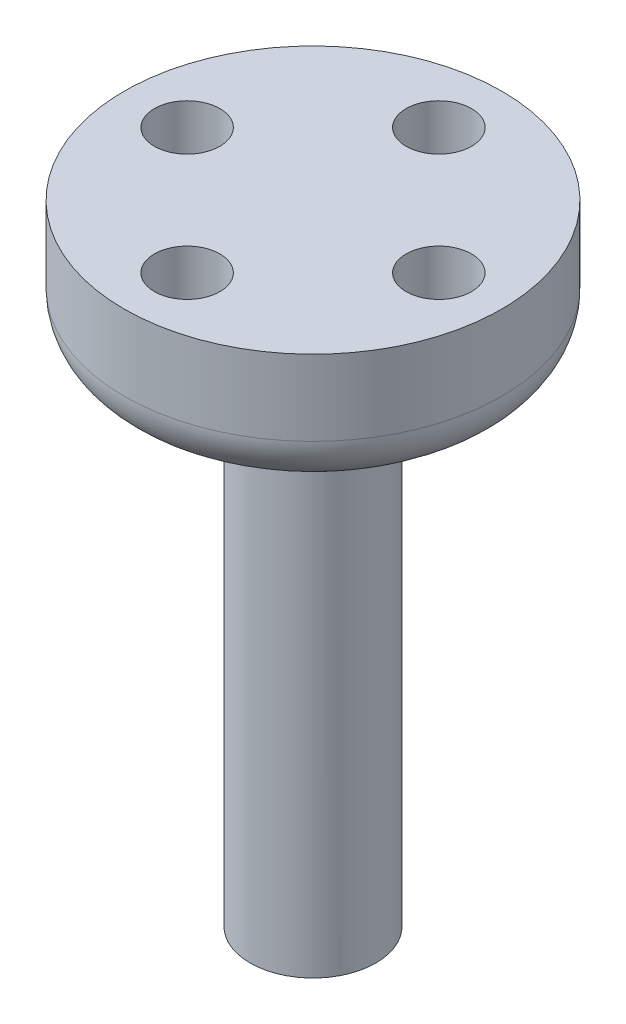
ISO-10303-21;
HEADER;
FILE_DESCRIPTION(('STEP AP214'),'2;1');
FILE_NAME('part.step','',(''),(''),'','','');
FILE_SCHEMA(('AUTOMOTIVE_DESIGN { 1 0 10303 214 1 1 1 1 }'));
ENDSEC;
DATA;
#1=APPLICATION_CONTEXT('core data for automotive mechanical design processes');
#2=APPLICATION_PROTOCOL_DEFINITION('international standard','automotive_design',2000,#1);
#3=PRODUCT_CONTEXT('',#1,'mechanical');
#4=PRODUCT('Part','Part','',(#3));
#5=PRODUCT_RELATED_PRODUCT_CATEGORY('part','',(#4));
#6=PRODUCT_DEFINITION_FORMATION('','',#4);
#7=PRODUCT_DEFINITION_CONTEXT('part definition',#1,'design');
#8=PRODUCT_DEFINITION('design','',#6,#7);
#9=PRODUCT_DEFINITION_SHAPE('','',#8);
#10=(LENGTH_UNIT() NAMED_UNIT(*) SI_UNIT(.MILLI.,.METRE.));
#11=(NAMED_UNIT(*) PLANE_ANGLE_UNIT() SI_UNIT($,.RADIAN.));
#12=(NAMED_UNIT(*) SI_UNIT($,.STERADIAN.) SOLID_ANGLE_UNIT());
#13=UNCERTAINTY_MEASURE_WITH_UNIT(LENGTH_MEASURE(1.E-05),#10,'distance_accuracy_value','');
#14=(GEOMETRIC_REPRESENTATION_CONTEXT(3) GLOBAL_UNCERTAINTY_ASSIGNED_CONTEXT((#13)) GLOBAL_UNIT_ASSIGNED_CONTEXT((#10,
#11,#12)) REPRESENTATION_CONTEXT('',''));
#15=CARTESIAN_POINT('',(0.,0.,0.));
#16=DIRECTION('',(0.,0.,1.));
#17=DIRECTION('',(1.,0.,0.));
#18=AXIS2_PLACEMENT_3D('',#15,#16,#17);
#19=CARTESIAN_POINT('',(0.,5.,0.));
#20=DIRECTION('',(0.,-1.,0.));
#21=DIRECTION('',(0.,0.,-1.));
#22=AXIS2_PLACEMENT_3D('',#19,#20,#21);
#23=CYLINDRICAL_SURFACE('',#22,7.5);
#24=CARTESIAN_POINT('',(0.,2.,0.));
#25=DIRECTION('',(0.,1.,0.));
#26=DIRECTION('',(0.,0.,1.));
#27=AXIS2_PLACEMENT_3D('',#24,#25,#26);
#28=CIRCLE('',#27,7.5);
#29=CARTESIAN_POINT('',(0.,2.,7.5));
#30=VERTEX_POINT('',#29);
#31=EDGE_CURVE('E42',#30,#30,#28,.T.);
#32=ORIENTED_EDGE('',*,*,#31,.T.);
#33=EDGE_LOOP('',(#32));
#34=FACE_BOUND('',#33,.T.);
#35=CARTESIAN_POINT('',(0.,5.,0.));
#36=DIRECTION('',(0.,1.,0.));
#37=DIRECTION('',(0.,0.,1.));
#38=AXIS2_PLACEMENT_3D('',#35,#36,#37);
#39=CIRCLE('',#38,7.5);
#40=CARTESIAN_POINT('',(0.,5.,7.5));
#41=VERTEX_POINT('',#40);
#42=EDGE_CURVE('E46',#41,#41,#39,.T.);
#43=ORIENTED_EDGE('',*,*,#42,.F.);
#44=EDGE_LOOP('',(#43));
#45=FACE_BOUND('',#44,.T.);
#46=ADVANCED_FACE('F31',(#34,#45),#23,.T.);
#47=CARTESIAN_POINT('',(0.,5.,0.));
#48=DIRECTION('',(0.,1.,0.));
#49=DIRECTION('',(0.,0.,1.));
#50=AXIS2_PLACEMENT_3D('',#47,#48,#49);
#51=PLANE('',#50);
#52=CARTESIAN_POINT('',(0.,5.,-5.));
#53=DIRECTION('',(0.,1.,0.));
#54=DIRECTION('',(0.,0.,1.));
#55=AXIS2_PLACEMENT_3D('',#52,#53,#54);
#56=CIRCLE('',#55,1.3);
#57=CARTESIAN_POINT('',(0.,5.,-3.7));
#58=VERTEX_POINT('',#57);
#59=EDGE_CURVE('E71',#58,#58,#56,.T.);
#60=ORIENTED_EDGE('',*,*,#59,.F.);
#61=EDGE_LOOP('',(#60));
#62=FACE_BOUND('',#61,.T.);
#63=CARTESIAN_POINT('',(5.,5.,0.));
#64=DIRECTION('',(0.,1.,0.));
#65=DIRECTION('',(0.,0.,1.));
#66=AXIS2_PLACEMENT_3D('',#63,#64,#65);
#67=CIRCLE('',#66,1.3);
#68=CARTESIAN_POINT('',(5.,5.,1.3));
#69=VERTEX_POINT('',#68);
#70=EDGE_CURVE('E65',#69,#69,#67,.T.);
#71=ORIENTED_EDGE('',*,*,#70,.F.);
#72=EDGE_LOOP('',(#71));
#73=FACE_BOUND('',#72,.T.);
#74=CARTESIAN_POINT('',(0.,5.,5.));
#75=DIRECTION('',(0.,1.,0.));
#76=DIRECTION('',(0.,0.,1.));
#77=AXIS2_PLACEMENT_3D('',#74,#75,#76);
#78=CIRCLE('',#77,1.3);
#79=CARTESIAN_POINT('',(0.,5.,6.3));
#80=VERTEX_POINT('',#79);
#81=EDGE_CURVE('E59',#80,#80,#78,.T.);
#82=ORIENTED_EDGE('',*,*,#81,.F.);
#83=EDGE_LOOP('',(#82));
#84=FACE_BOUND('',#83,.T.);
#85=CARTESIAN_POINT('',(-5.,5.,0.));
#86=DIRECTION('',(0.,1.,0.));
#87=DIRECTION('',(0.,0.,1.));
#88=AXIS2_PLACEMENT_3D('',#85,#86,#87);
#89=CIRCLE('',#88,1.3);
#90=CARTESIAN_POINT('',(-5.,5.,1.3));
#91=VERTEX_POINT('',#90);
#92=EDGE_CURVE('E52',#91,#91,#89,.T.);
#93=ORIENTED_EDGE('',*,*,#92,.F.);
#94=EDGE_LOOP('',(#93));
#95=FACE_BOUND('',#94,.T.);
#96=ORIENTED_EDGE('',*,*,#42,.T.);
#97=EDGE_LOOP('',(#96));
#98=FACE_BOUND('',#97,.T.);
#99=ADVANCED_FACE('F93',(#62,#73,#84,#95,#98),#51,.T.);
#100=CARTESIAN_POINT('',(0.,0.,0.));
#101=DIRECTION('',(0.,1.,0.));
#102=DIRECTION('',(0.,0.,1.));
#103=AXIS2_PLACEMENT_3D('',#100,#101,#102);
#104=PLANE('',#103);
#105=CARTESIAN_POINT('',(0.,0.,0.));
#106=DIRECTION('',(0.,1.,0.));
#107=DIRECTION('',(0.,0.,1.));
#108=AXIS2_PLACEMENT_3D('',#105,#106,#107);
#109=CIRCLE('',#108,2.5);
#110=CARTESIAN_POINT('',(0.,0.,2.5));
#111=VERTEX_POINT('',#110);
#112=EDGE_CURVE('E10',#111,#111,#109,.F.);
#113=ORIENTED_EDGE('',*,*,#112,.F.);
#114=EDGE_LOOP('',(#113));
#115=FACE_BOUND('',#114,.T.);
#116=CARTESIAN_POINT('',(0.,0.,0.));
#117=DIRECTION('',(0.,1.,0.));
#118=DIRECTION('',(0.,0.,1.));
#119=AXIS2_PLACEMENT_3D('',#116,#117,#118);
#120=CIRCLE('',#119,5.5);
#121=CARTESIAN_POINT('',(0.,0.,5.5));
#122=VERTEX_POINT('',#121);
#123=EDGE_CURVE('E38',#122,#122,#120,.F.);
#124=ORIENTED_EDGE('',*,*,#123,.T.);
#125=EDGE_LOOP('',(#124));
#126=FACE_BOUND('',#125,.T.);
#127=ADVANCED_FACE('F98',(#115,#126),#104,.F.);
#128=CARTESIAN_POINT('',(-5.,2.,0.));
#129=DIRECTION('',(0.,1.,0.));
#130=DIRECTION('',(0.,0.,1.));
#131=AXIS2_PLACEMENT_3D('',#128,#129,#130);
#132=CYLINDRICAL_SURFACE('',#131,1.3);
#133=CARTESIAN_POINT('',(-5.,2.,0.));
#134=DIRECTION('',(0.,1.,0.));
#135=DIRECTION('',(0.,0.,1.));
#136=AXIS2_PLACEMENT_3D('',#133,#134,#135);
#137=CIRCLE('',#136,1.3);
#138=CARTESIAN_POINT('',(-5.,2.,1.3));
#139=VERTEX_POINT('',#138);
#140=EDGE_CURVE('E55',#139,#139,#137,.T.);
#141=ORIENTED_EDGE('',*,*,#140,.F.);
#142=EDGE_LOOP('',(#141));
#143=FACE_BOUND('',#142,.T.);
#144=ORIENTED_EDGE('',*,*,#92,.T.);
#145=EDGE_LOOP('',(#144));
#146=FACE_BOUND('',#145,.T.);
#147=ADVANCED_FACE('F104',(#143,#146),#132,.F.);
#148=CARTESIAN_POINT('',(-5.,2.,0.));
#149=DIRECTION('',(0.,1.,0.));
#150=DIRECTION('',(0.,0.,1.));
#151=AXIS2_PLACEMENT_3D('',#148,#149,#150);
#152=PLANE('',#151);
#153=ORIENTED_EDGE('',*,*,#140,.T.);
#154=EDGE_LOOP('',(#153));
#155=FACE_BOUND('',#154,.T.);
#156=ADVANCED_FACE('F109',(#155),#152,.T.);
#157=CARTESIAN_POINT('',(0.,2.,5.));
#158=DIRECTION('',(0.,1.,0.));
#159=DIRECTION('',(0.,0.,1.));
#160=AXIS2_PLACEMENT_3D('',#157,#158,#159);
#161=CYLINDRICAL_SURFACE('',#160,1.3);
#162=CARTESIAN_POINT('',(0.,2.,5.));
#163=DIRECTION('',(0.,1.,0.));
#164=DIRECTION('',(0.,0.,1.));
#165=AXIS2_PLACEMENT_3D('',#162,#163,#164);
#166=CIRCLE('',#165,1.3);
#167=CARTESIAN_POINT('',(0.,2.,6.3));
#168=VERTEX_POINT('',#167);
#169=EDGE_CURVE('E62',#168,#168,#166,.T.);
#170=ORIENTED_EDGE('',*,*,#169,.F.);
#171=EDGE_LOOP('',(#170));
#172=FACE_BOUND('',#171,.T.);
#173=ORIENTED_EDGE('',*,*,#81,.T.);
#174=EDGE_LOOP('',(#173));
#175=FACE_BOUND('',#174,.T.);
#176=ADVANCED_FACE('F113',(#172,#175),#161,.F.);
#177=CARTESIAN_POINT('',(0.,2.,5.));
#178=DIRECTION('',(0.,1.,0.));
#179=DIRECTION('',(0.,0.,1.));
#180=AXIS2_PLACEMENT_3D('',#177,#178,#179);
#181=PLANE('',#180);
#182=ORIENTED_EDGE('',*,*,#169,.T.);
#183=EDGE_LOOP('',(#182));
#184=FACE_BOUND('',#183,.T.);
#185=ADVANCED_FACE('F117',(#184),#181,.T.);
#186=CARTESIAN_POINT('',(5.,2.,0.));
#187=DIRECTION('',(0.,1.,0.));
#188=DIRECTION('',(0.,0.,1.));
#189=AXIS2_PLACEMENT_3D('',#186,#187,#188);
#190=CYLINDRICAL_SURFACE('',#189,1.3);
#191=CARTESIAN_POINT('',(5.,2.,0.));
#192=DIRECTION('',(0.,1.,0.));
#193=DIRECTION('',(0.,0.,1.));
#194=AXIS2_PLACEMENT_3D('',#191,#192,#193);
#195=CIRCLE('',#194,1.3);
#196=CARTESIAN_POINT('',(5.,2.,1.3));
#197=VERTEX_POINT('',#196);
#198=EDGE_CURVE('E68',#197,#197,#195,.T.);
#199=ORIENTED_EDGE('',*,*,#198,.F.);
#200=EDGE_LOOP('',(#199));
#201=FACE_BOUND('',#200,.T.);
#202=ORIENTED_EDGE('',*,*,#70,.T.);
#203=EDGE_LOOP('',(#202));
#204=FACE_BOUND('',#203,.T.);
#205=ADVANCED_FACE('F121',(#201,#204),#190,.F.);
#206=CARTESIAN_POINT('',(5.,2.,0.));
#207=DIRECTION('',(0.,1.,0.));
#208=DIRECTION('',(0.,0.,1.));
#209=AXIS2_PLACEMENT_3D('',#206,#207,#208);
#210=PLANE('',#209);
#211=ORIENTED_EDGE('',*,*,#198,.T.);
#212=EDGE_LOOP('',(#211));
#213=FACE_BOUND('',#212,.T.);
#214=ADVANCED_FACE('F125',(#213),#210,.T.);
#215=CARTESIAN_POINT('',(0.,2.,-5.));
#216=DIRECTION('',(0.,1.,0.));
#217=DIRECTION('',(0.,0.,1.));
#218=AXIS2_PLACEMENT_3D('',#215,#216,#217);
#219=CYLINDRICAL_SURFACE('',#218,1.3);
#220=CARTESIAN_POINT('',(0.,2.,-5.));
#221=DIRECTION('',(0.,1.,0.));
#222=DIRECTION('',(0.,0.,1.));
#223=AXIS2_PLACEMENT_3D('',#220,#221,#222);
#224=CIRCLE('',#223,1.3);
#225=CARTESIAN_POINT('',(0.,2.,-3.7));
#226=VERTEX_POINT('',#225);
#227=EDGE_CURVE('E51',#226,#226,#224,.T.);
#228=ORIENTED_EDGE('',*,*,#227,.F.);
#229=EDGE_LOOP('',(#228));
#230=FACE_BOUND('',#229,.T.);
#231=ORIENTED_EDGE('',*,*,#59,.T.);
#232=EDGE_LOOP('',(#231));
#233=FACE_BOUND('',#232,.T.);
#234=ADVANCED_FACE('F129',(#230,#233),#219,.F.);
#235=CARTESIAN_POINT('',(0.,2.,-5.));
#236=DIRECTION('',(0.,1.,0.));
#237=DIRECTION('',(0.,0.,1.));
#238=AXIS2_PLACEMENT_3D('',#235,#236,#237);
#239=PLANE('',#238);
#240=ORIENTED_EDGE('',*,*,#227,.T.);
#241=EDGE_LOOP('',(#240));
#242=FACE_BOUND('',#241,.T.);
#243=ADVANCED_FACE('F89',(#242),#239,.T.);
#244=CARTESIAN_POINT('',(0.,2.,0.));
#245=DIRECTION('',(0.,1.,0.));
#246=DIRECTION('',(0.,0.,1.));
#247=AXIS2_PLACEMENT_3D('',#244,#245,#246);
#248=TOROIDAL_SURFACE('',#247,5.5,2.);
#249=ORIENTED_EDGE('',*,*,#123,.F.);
#250=EDGE_LOOP('',(#249));
#251=FACE_BOUND('',#250,.T.);
#252=ORIENTED_EDGE('',*,*,#31,.F.);
#253=EDGE_LOOP('',(#252));
#254=FACE_BOUND('',#253,.T.);
#255=ADVANCED_FACE('F33',(#251,#254),#248,.T.);
#256=CARTESIAN_POINT('',(0.,-20.,0.));
#257=DIRECTION('',(0.,1.,0.));
#258=DIRECTION('',(0.,0.,1.));
#259=AXIS2_PLACEMENT_3D('',#256,#257,#258);
#260=CYLINDRICAL_SURFACE('',#259,2.5);
#261=CARTESIAN_POINT('',(0.,-20.,0.));
#262=DIRECTION('',(0.,-1.,0.));
#263=DIRECTION('',(0.,0.,-1.));
#264=AXIS2_PLACEMENT_3D('',#261,#262,#263);
#265=CIRCLE('',#264,2.5);
#266=CARTESIAN_POINT('',(0.,-20.,-2.5));
#267=VERTEX_POINT('',#266);
#268=EDGE_CURVE('E56',#267,#267,#265,.T.);
#269=ORIENTED_EDGE('',*,*,#268,.F.);
#270=EDGE_LOOP('',(#269));
#271=FACE_BOUND('',#270,.T.);
#272=ORIENTED_EDGE('',*,*,#112,.T.);
#273=EDGE_LOOP('',(#272));
#274=FACE_BOUND('',#273,.T.);
#275=ADVANCED_FACE('F81',(#271,#274),#260,.T.);
#276=CARTESIAN_POINT('',(0.,-20.,0.));
#277=DIRECTION('',(0.,-1.,0.));
#278=DIRECTION('',(0.,0.,-1.));
#279=AXIS2_PLACEMENT_3D('',#276,#277,#278);
#280=PLANE('',#279);
#281=ORIENTED_EDGE('',*,*,#268,.T.);
#282=EDGE_LOOP('',(#281));
#283=FACE_BOUND('',#282,.T.);
#284=ADVANCED_FACE('F79',(#283),#280,.T.);
#285=CLOSED_SHELL('',(#46,#99,#127,#147,#156,#176,#185,#205,#214,#234,#243,#255,#275,#284));
#286=MANIFOLD_SOLID_BREP('B2',#285);
#287=ADVANCED_BREP_SHAPE_REPRESENTATION('',(#18,#286),#14);
#288=SHAPE_DEFINITION_REPRESENTATION(#9,#287);
ENDSEC;
END-ISO-10303-21;
